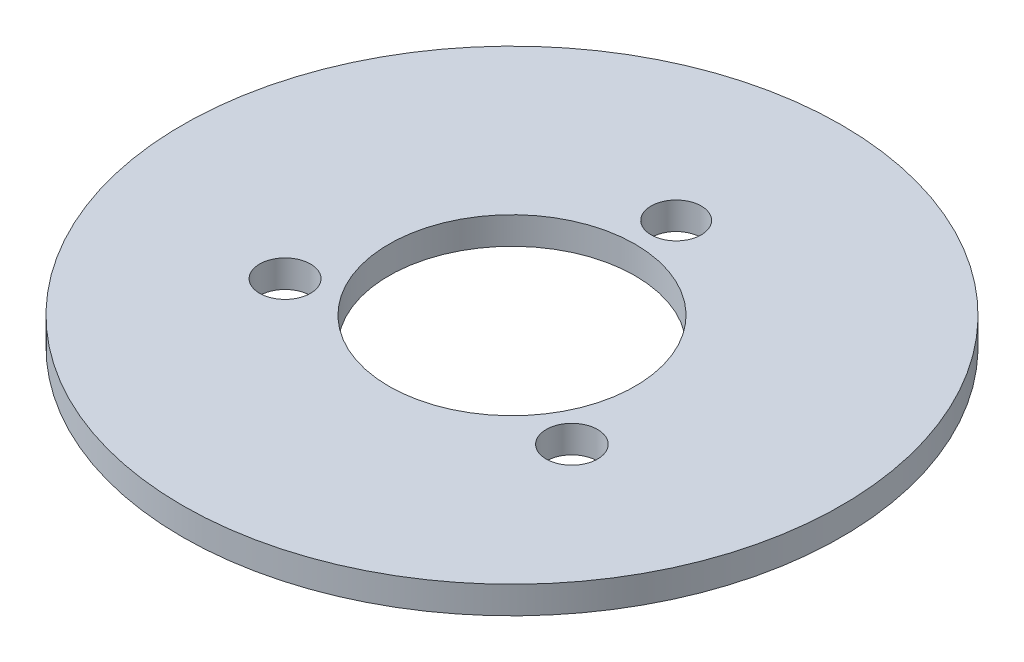
ISO-10303-21;
HEADER;
FILE_DESCRIPTION(('STEP AP214'),'2;1');
FILE_NAME('part.step','',(''),(''),'','','');
FILE_SCHEMA(('AUTOMOTIVE_DESIGN { 1 0 10303 214 1 1 1 1 }'));
ENDSEC;
DATA;
#1=APPLICATION_CONTEXT('core data for automotive mechanical design processes');
#2=APPLICATION_PROTOCOL_DEFINITION('international standard','automotive_design',2000,#1);
#3=PRODUCT_CONTEXT('',#1,'mechanical');
#4=PRODUCT('Part','Part','',(#3));
#5=PRODUCT_RELATED_PRODUCT_CATEGORY('part','',(#4));
#6=PRODUCT_DEFINITION_FORMATION('','',#4);
#7=PRODUCT_DEFINITION_CONTEXT('part definition',#1,'design');
#8=PRODUCT_DEFINITION('design','',#6,#7);
#9=PRODUCT_DEFINITION_SHAPE('','',#8);
#10=(LENGTH_UNIT() NAMED_UNIT(*) SI_UNIT(.MILLI.,.METRE.));
#11=(NAMED_UNIT(*) PLANE_ANGLE_UNIT() SI_UNIT($,.RADIAN.));
#12=(NAMED_UNIT(*) SI_UNIT($,.STERADIAN.) SOLID_ANGLE_UNIT());
#13=UNCERTAINTY_MEASURE_WITH_UNIT(LENGTH_MEASURE(1.E-05),#10,'distance_accuracy_value','');
#14=(GEOMETRIC_REPRESENTATION_CONTEXT(3) GLOBAL_UNCERTAINTY_ASSIGNED_CONTEXT((#13)) GLOBAL_UNIT_ASSIGNED_CONTEXT((#10,
#11,#12)) REPRESENTATION_CONTEXT('',''));
#15=CARTESIAN_POINT('',(0.,0.,0.));
#16=DIRECTION('',(0.,0.,1.));
#17=DIRECTION('',(1.,0.,0.));
#18=AXIS2_PLACEMENT_3D('',#15,#16,#17);
#19=CARTESIAN_POINT('',(-16.8411707264414,3.175,9.49424536669134));
#20=DIRECTION('',(0.,-1.,0.));
#21=DIRECTION('',(0.,0.,-1.));
#22=AXIS2_PLACEMENT_3D('',#19,#20,#21);
#23=CYLINDRICAL_SURFACE('',#22,2.95288061806471);
#24=CARTESIAN_POINT('',(-16.8411707264414,3.175,9.49424536669134));
#25=DIRECTION('',(0.,1.,0.));
#26=DIRECTION('',(0.,0.,1.));
#27=AXIS2_PLACEMENT_3D('',#24,#25,#26);
#28=CIRCLE('',#27,2.95288061806471);
#29=CARTESIAN_POINT('',(-16.8411707264414,3.175,12.447125984756));
#30=VERTEX_POINT('',#29);
#31=EDGE_CURVE('E40',#30,#30,#28,.T.);
#32=ORIENTED_EDGE('',*,*,#31,.T.);
#33=EDGE_LOOP('',(#32));
#34=FACE_BOUND('',#33,.T.);
#35=CARTESIAN_POINT('',(-16.8411707264414,0.,9.49424536669134));
#36=DIRECTION('',(0.,1.,0.));
#37=DIRECTION('',(0.,0.,1.));
#38=AXIS2_PLACEMENT_3D('',#35,#36,#37);
#39=CIRCLE('',#38,2.95288061806471);
#40=CARTESIAN_POINT('',(-16.8411707264414,0.,12.447125984756));
#41=VERTEX_POINT('',#40);
#42=EDGE_CURVE('E55',#41,#41,#39,.T.);
#43=ORIENTED_EDGE('',*,*,#42,.F.);
#44=EDGE_LOOP('',(#43));
#45=FACE_BOUND('',#44,.T.);
#46=ADVANCED_FACE('F32',(#34,#45),#23,.F.);
#47=CARTESIAN_POINT('',(16.4445153546346,3.175,9.49424536669134));
#48=DIRECTION('',(0.,-1.,0.));
#49=DIRECTION('',(0.,0.,-1.));
#50=AXIS2_PLACEMENT_3D('',#47,#48,#49);
#51=CYLINDRICAL_SURFACE('',#50,2.97962175698696);
#52=CARTESIAN_POINT('',(16.4445153546346,3.175,9.49424536669134));
#53=DIRECTION('',(0.,1.,0.));
#54=DIRECTION('',(0.,0.,1.));
#55=AXIS2_PLACEMENT_3D('',#52,#53,#54);
#56=CIRCLE('',#55,2.97962175698696);
#57=CARTESIAN_POINT('',(16.4445153546346,3.175,12.4738671236783));
#58=VERTEX_POINT('',#57);
#59=EDGE_CURVE('E45',#58,#58,#56,.T.);
#60=ORIENTED_EDGE('',*,*,#59,.T.);
#61=EDGE_LOOP('',(#60));
#62=FACE_BOUND('',#61,.T.);
#63=CARTESIAN_POINT('',(16.4445153546346,0.,9.49424536669134));
#64=DIRECTION('',(0.,1.,0.));
#65=DIRECTION('',(0.,0.,1.));
#66=AXIS2_PLACEMENT_3D('',#63,#64,#65);
#67=CIRCLE('',#66,2.97962175698696);
#68=CARTESIAN_POINT('',(16.4445153546346,0.,12.4738671236783));
#69=VERTEX_POINT('',#68);
#70=EDGE_CURVE('E52',#69,#69,#67,.T.);
#71=ORIENTED_EDGE('',*,*,#70,.F.);
#72=EDGE_LOOP('',(#71));
#73=FACE_BOUND('',#72,.T.);
#74=ADVANCED_FACE('F93',(#62,#73),#51,.F.);
#75=CARTESIAN_POINT('',(0.,3.175,-19.05));
#76=DIRECTION('',(0.,-1.,0.));
#77=DIRECTION('',(0.,0.,-1.));
#78=AXIS2_PLACEMENT_3D('',#75,#76,#77);
#79=CYLINDRICAL_SURFACE('',#78,2.90910213730794);
#80=CARTESIAN_POINT('',(0.,3.175,-19.05));
#81=DIRECTION('',(0.,1.,0.));
#82=DIRECTION('',(0.,0.,1.));
#83=AXIS2_PLACEMENT_3D('',#80,#81,#82);
#84=CIRCLE('',#83,2.90910213730794);
#85=CARTESIAN_POINT('',(0.,3.175,-16.1408978626921));
#86=VERTEX_POINT('',#85);
#87=EDGE_CURVE('E60',#86,#86,#84,.T.);
#88=ORIENTED_EDGE('',*,*,#87,.T.);
#89=EDGE_LOOP('',(#88));
#90=FACE_BOUND('',#89,.T.);
#91=CARTESIAN_POINT('',(0.,0.,-19.05));
#92=DIRECTION('',(0.,1.,0.));
#93=DIRECTION('',(0.,0.,1.));
#94=AXIS2_PLACEMENT_3D('',#91,#92,#93);
#95=CIRCLE('',#94,2.90910213730794);
#96=CARTESIAN_POINT('',(0.,0.,-16.1408978626921));
#97=VERTEX_POINT('',#96);
#98=EDGE_CURVE('E49',#97,#97,#95,.T.);
#99=ORIENTED_EDGE('',*,*,#98,.F.);
#100=EDGE_LOOP('',(#99));
#101=FACE_BOUND('',#100,.T.);
#102=ADVANCED_FACE('F34',(#90,#101),#79,.F.);
#103=CARTESIAN_POINT('',(0.,3.175,0.));
#104=DIRECTION('',(0.,-1.,0.));
#105=DIRECTION('',(0.,0.,-1.));
#106=AXIS2_PLACEMENT_3D('',#103,#104,#105);
#107=CYLINDRICAL_SURFACE('',#106,38.2438751150373);
#108=CARTESIAN_POINT('',(0.,3.175,0.));
#109=DIRECTION('',(0.,1.,0.));
#110=DIRECTION('',(0.,0.,1.));
#111=AXIS2_PLACEMENT_3D('',#108,#109,#110);
#112=CIRCLE('',#111,38.2438751150373);
#113=CARTESIAN_POINT('',(0.,3.175,38.2438751150373));
#114=VERTEX_POINT('',#113);
#115=EDGE_CURVE('E10',#114,#114,#112,.T.);
#116=ORIENTED_EDGE('',*,*,#115,.F.);
#117=EDGE_LOOP('',(#116));
#118=FACE_BOUND('',#117,.T.);
#119=CARTESIAN_POINT('',(0.,0.,0.));
#120=DIRECTION('',(0.,1.,0.));
#121=DIRECTION('',(0.,0.,1.));
#122=AXIS2_PLACEMENT_3D('',#119,#120,#121);
#123=CIRCLE('',#122,38.2438751150373);
#124=CARTESIAN_POINT('',(0.,0.,38.2438751150373));
#125=VERTEX_POINT('',#124);
#126=EDGE_CURVE('E36',#125,#125,#123,.T.);
#127=ORIENTED_EDGE('',*,*,#126,.T.);
#128=EDGE_LOOP('',(#127));
#129=FACE_BOUND('',#128,.T.);
#130=ADVANCED_FACE('F100',(#118,#129),#107,.T.);
#131=CARTESIAN_POINT('',(0.,3.175,0.));
#132=DIRECTION('',(0.,1.,0.));
#133=DIRECTION('',(0.,0.,1.));
#134=AXIS2_PLACEMENT_3D('',#131,#132,#133);
#135=PLANE('',#134);
#136=CARTESIAN_POINT('',(0.,3.175,0.));
#137=DIRECTION('',(0.,-1.,0.));
#138=DIRECTION('',(0.,0.,-1.));
#139=AXIS2_PLACEMENT_3D('',#136,#137,#138);
#140=CIRCLE('',#139,14.2875);
#141=CARTESIAN_POINT('',(0.,3.175,-14.2875));
#142=VERTEX_POINT('',#141);
#143=EDGE_CURVE('E53',#142,#142,#140,.T.);
#144=ORIENTED_EDGE('',*,*,#143,.T.);
#145=EDGE_LOOP('',(#144));
#146=FACE_BOUND('',#145,.T.);
#147=ORIENTED_EDGE('',*,*,#87,.F.);
#148=EDGE_LOOP('',(#147));
#149=FACE_BOUND('',#148,.T.);
#150=ORIENTED_EDGE('',*,*,#59,.F.);
#151=EDGE_LOOP('',(#150));
#152=FACE_BOUND('',#151,.T.);
#153=ORIENTED_EDGE('',*,*,#31,.F.);
#154=EDGE_LOOP('',(#153));
#155=FACE_BOUND('',#154,.T.);
#156=ORIENTED_EDGE('',*,*,#115,.T.);
#157=EDGE_LOOP('',(#156));
#158=FACE_BOUND('',#157,.T.);
#159=ADVANCED_FACE('F75',(#146,#149,#152,#155,#158),#135,.T.);
#160=CARTESIAN_POINT('',(0.,0.,0.));
#161=DIRECTION('',(0.,1.,0.));
#162=DIRECTION('',(0.,0.,1.));
#163=AXIS2_PLACEMENT_3D('',#160,#161,#162);
#164=PLANE('',#163);
#165=CARTESIAN_POINT('',(0.,0.,0.));
#166=DIRECTION('',(0.,-1.,0.));
#167=DIRECTION('',(0.,0.,-1.));
#168=AXIS2_PLACEMENT_3D('',#165,#166,#167);
#169=CIRCLE('',#168,14.2875);
#170=CARTESIAN_POINT('',(0.,0.,-14.2875));
#171=VERTEX_POINT('',#170);
#172=EDGE_CURVE('E69',#171,#171,#169,.T.);
#173=ORIENTED_EDGE('',*,*,#172,.F.);
#174=EDGE_LOOP('',(#173));
#175=FACE_BOUND('',#174,.T.);
#176=ORIENTED_EDGE('',*,*,#98,.T.);
#177=EDGE_LOOP('',(#176));
#178=FACE_BOUND('',#177,.T.);
#179=ORIENTED_EDGE('',*,*,#70,.T.);
#180=EDGE_LOOP('',(#179));
#181=FACE_BOUND('',#180,.T.);
#182=ORIENTED_EDGE('',*,*,#42,.T.);
#183=EDGE_LOOP('',(#182));
#184=FACE_BOUND('',#183,.T.);
#185=ORIENTED_EDGE('',*,*,#126,.F.);
#186=EDGE_LOOP('',(#185));
#187=FACE_BOUND('',#186,.T.);
#188=ADVANCED_FACE('F81',(#175,#178,#181,#184,#187),#164,.F.);
#189=CARTESIAN_POINT('',(0.,3.175,0.));
#190=DIRECTION('',(0.,-1.,0.));
#191=DIRECTION('',(0.,0.,-1.));
#192=AXIS2_PLACEMENT_3D('',#189,#190,#191);
#193=CYLINDRICAL_SURFACE('',#192,14.2875);
#194=ORIENTED_EDGE('',*,*,#143,.F.);
#195=EDGE_LOOP('',(#194));
#196=FACE_BOUND('',#195,.T.);
#197=ORIENTED_EDGE('',*,*,#172,.T.);
#198=EDGE_LOOP('',(#197));
#199=FACE_BOUND('',#198,.T.);
#200=ADVANCED_FACE('F78',(#196,#199),#193,.F.);
#201=CLOSED_SHELL('',(#46,#74,#102,#130,#159,#188,#200));
#202=MANIFOLD_SOLID_BREP('B2',#201);
#203=ADVANCED_BREP_SHAPE_REPRESENTATION('',(#18,#202),#14);
#204=SHAPE_DEFINITION_REPRESENTATION(#9,#203);
ENDSEC;
END-ISO-10303-21;
